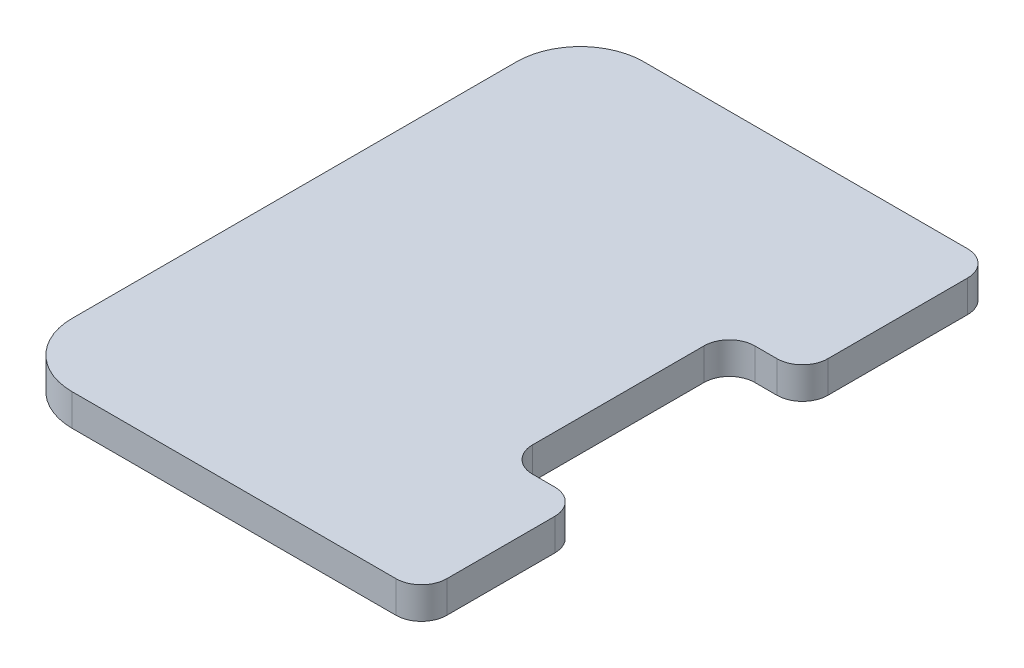
ISO-10303-21;
HEADER;
FILE_DESCRIPTION(('STEP AP214'),'2;1');
FILE_NAME('part.step','',(''),(''),'','','');
FILE_SCHEMA(('AUTOMOTIVE_DESIGN { 1 0 10303 214 1 1 1 1 }'));
ENDSEC;
DATA;
#1=APPLICATION_CONTEXT('core data for automotive mechanical design processes');
#2=APPLICATION_PROTOCOL_DEFINITION('international standard','automotive_design',2000,#1);
#3=PRODUCT_CONTEXT('',#1,'mechanical');
#4=PRODUCT('Part','Part','',(#3));
#5=PRODUCT_RELATED_PRODUCT_CATEGORY('part','',(#4));
#6=PRODUCT_DEFINITION_FORMATION('','',#4);
#7=PRODUCT_DEFINITION_CONTEXT('part definition',#1,'design');
#8=PRODUCT_DEFINITION('design','',#6,#7);
#9=PRODUCT_DEFINITION_SHAPE('','',#8);
#10=(LENGTH_UNIT() NAMED_UNIT(*) SI_UNIT(.MILLI.,.METRE.));
#11=(NAMED_UNIT(*) PLANE_ANGLE_UNIT() SI_UNIT($,.RADIAN.));
#12=(NAMED_UNIT(*) SI_UNIT($,.STERADIAN.) SOLID_ANGLE_UNIT());
#13=UNCERTAINTY_MEASURE_WITH_UNIT(LENGTH_MEASURE(1.E-05),#10,'distance_accuracy_value','');
#14=(GEOMETRIC_REPRESENTATION_CONTEXT(3) GLOBAL_UNCERTAINTY_ASSIGNED_CONTEXT((#13)) GLOBAL_UNIT_ASSIGNED_CONTEXT((#10,
#11,#12)) REPRESENTATION_CONTEXT('',''));
#15=CARTESIAN_POINT('',(0.,0.,0.));
#16=DIRECTION('',(0.,0.,1.));
#17=DIRECTION('',(1.,0.,0.));
#18=AXIS2_PLACEMENT_3D('',#15,#16,#17);
#19=CARTESIAN_POINT('',(20.6375,3.175,-28.575));
#20=DIRECTION('',(-1.,0.,0.));
#21=DIRECTION('',(0.,0.,-1.));
#22=AXIS2_PLACEMENT_3D('',#19,#20,#21);
#23=PLANE('',#22);
#24=DIRECTION('',(0.,0.,1.));
#25=VECTOR('',#24,1.);
#26=CARTESIAN_POINT('',(20.6375,3.175,-28.575));
#27=LINE('',#26,#25);
#28=CARTESIAN_POINT('',(20.6375,3.175,-26.035));
#29=VERTEX_POINT('',#28);
#30=CARTESIAN_POINT('',(20.6375,3.175,-12.065));
#31=VERTEX_POINT('',#30);
#32=EDGE_CURVE('E346',#29,#31,#27,.T.);
#33=ORIENTED_EDGE('',*,*,#32,.T.);
#34=DIRECTION('',(0.,1.,0.));
#35=VECTOR('',#34,1.);
#36=CARTESIAN_POINT('',(20.6375,3.175,-12.065));
#37=LINE('',#36,#35);
#38=CARTESIAN_POINT('',(20.6375,0.,-12.065));
#39=VERTEX_POINT('',#38);
#40=EDGE_CURVE('E216',#39,#31,#37,.T.);
#41=ORIENTED_EDGE('',*,*,#40,.F.);
#42=DIRECTION('',(0.,0.,1.));
#43=VECTOR('',#42,1.);
#44=CARTESIAN_POINT('',(20.6375,0.,-28.575));
#45=LINE('',#44,#43);
#46=CARTESIAN_POINT('',(20.6375,0.,-26.035));
#47=VERTEX_POINT('',#46);
#48=EDGE_CURVE('E196',#47,#39,#45,.T.);
#49=ORIENTED_EDGE('',*,*,#48,.F.);
#50=DIRECTION('',(0.,-1.,0.));
#51=VECTOR('',#50,1.);
#52=CARTESIAN_POINT('',(20.6375,3.175,-26.035));
#53=LINE('',#52,#51);
#54=EDGE_CURVE('E208',#29,#47,#53,.T.);
#55=ORIENTED_EDGE('',*,*,#54,.F.);
#56=EDGE_LOOP('',(#33,#41,#49,#55));
#57=FACE_BOUND('',#56,.T.);
#58=ADVANCED_FACE('F47',(#57),#23,.F.);
#59=CARTESIAN_POINT('',(20.6375,0.,15.24));
#60=VERTEX_POINT('',#59);
#61=CARTESIAN_POINT('',(20.6375,0.,26.035));
#62=VERTEX_POINT('',#61);
#63=EDGE_CURVE('E221',#60,#62,#45,.T.);
#64=ORIENTED_EDGE('',*,*,#63,.F.);
#65=DIRECTION('',(0.,1.,0.));
#66=VECTOR('',#65,1.);
#67=CARTESIAN_POINT('',(20.6375,3.175,15.24));
#68=LINE('',#67,#66);
#69=CARTESIAN_POINT('',(20.6375,3.175,15.24));
#70=VERTEX_POINT('',#69);
#71=EDGE_CURVE('E268',#70,#60,#68,.F.);
#72=ORIENTED_EDGE('',*,*,#71,.F.);
#73=CARTESIAN_POINT('',(20.6375,3.175,26.035));
#74=VERTEX_POINT('',#73);
#75=EDGE_CURVE('E241',#70,#74,#27,.T.);
#76=ORIENTED_EDGE('',*,*,#75,.T.);
#77=DIRECTION('',(0.,-1.,0.));
#78=VECTOR('',#77,1.);
#79=CARTESIAN_POINT('',(20.6375,3.175,26.035));
#80=LINE('',#79,#78);
#81=EDGE_CURVE('E272',#62,#74,#80,.F.);
#82=ORIENTED_EDGE('',*,*,#81,.F.);
#83=EDGE_LOOP('',(#64,#72,#76,#82));
#84=FACE_BOUND('',#83,.T.);
#85=ADVANCED_FACE('F393',(#84),#23,.F.);
#86=CARTESIAN_POINT('',(-20.6375,3.175,28.575));
#87=DIRECTION('',(0.,0.,-1.));
#88=DIRECTION('',(1.,0.,0.));
#89=AXIS2_PLACEMENT_3D('',#86,#87,#88);
#90=PLANE('',#89);
#91=DIRECTION('',(-1.,0.,0.));
#92=VECTOR('',#91,1.);
#93=CARTESIAN_POINT('',(-20.6375,0.,28.575));
#94=LINE('',#93,#92);
#95=CARTESIAN_POINT('',(18.0975,0.,28.575));
#96=VERTEX_POINT('',#95);
#97=CARTESIAN_POINT('',(-14.2875,0.,28.575));
#98=VERTEX_POINT('',#97);
#99=EDGE_CURVE('E220',#96,#98,#94,.T.);
#100=ORIENTED_EDGE('',*,*,#99,.F.);
#101=DIRECTION('',(0.,-1.,0.));
#102=VECTOR('',#101,1.);
#103=CARTESIAN_POINT('',(18.0975,3.175,28.575));
#104=LINE('',#103,#102);
#105=CARTESIAN_POINT('',(18.0975,3.175,28.575));
#106=VERTEX_POINT('',#105);
#107=EDGE_CURVE('E264',#106,#96,#104,.T.);
#108=ORIENTED_EDGE('',*,*,#107,.F.);
#109=DIRECTION('',(-1.,0.,0.));
#110=VECTOR('',#109,1.);
#111=CARTESIAN_POINT('',(-20.6375,3.175,28.575));
#112=LINE('',#111,#110);
#113=CARTESIAN_POINT('',(-14.2875,3.175,28.575));
#114=VERTEX_POINT('',#113);
#115=EDGE_CURVE('E341',#106,#114,#112,.T.);
#116=ORIENTED_EDGE('',*,*,#115,.T.);
#117=DIRECTION('',(0.,-1.,0.));
#118=VECTOR('',#117,1.);
#119=CARTESIAN_POINT('',(-14.2875,3.175,28.575));
#120=LINE('',#119,#118);
#121=EDGE_CURVE('E11',#98,#114,#120,.F.);
#122=ORIENTED_EDGE('',*,*,#121,.F.);
#123=EDGE_LOOP('',(#100,#108,#116,#122));
#124=FACE_BOUND('',#123,.T.);
#125=ADVANCED_FACE('F400',(#124),#90,.F.);
#126=CARTESIAN_POINT('',(-20.6375,3.175,-28.575));
#127=DIRECTION('',(1.,0.,0.));
#128=DIRECTION('',(0.,0.,1.));
#129=AXIS2_PLACEMENT_3D('',#126,#127,#128);
#130=PLANE('',#129);
#131=DIRECTION('',(0.,0.,-1.));
#132=VECTOR('',#131,1.);
#133=CARTESIAN_POINT('',(-20.6375,0.,-28.575));
#134=LINE('',#133,#132);
#135=CARTESIAN_POINT('',(-20.6375,0.,22.225));
#136=VERTEX_POINT('',#135);
#137=CARTESIAN_POINT('',(-20.6375,0.,-22.225));
#138=VERTEX_POINT('',#137);
#139=EDGE_CURVE('E227',#136,#138,#134,.T.);
#140=ORIENTED_EDGE('',*,*,#139,.F.);
#141=DIRECTION('',(0.,-1.,0.));
#142=VECTOR('',#141,1.);
#143=CARTESIAN_POINT('',(-20.6375,3.175,22.225));
#144=LINE('',#143,#142);
#145=CARTESIAN_POINT('',(-20.6375,3.175,22.225));
#146=VERTEX_POINT('',#145);
#147=EDGE_CURVE('E320',#146,#136,#144,.T.);
#148=ORIENTED_EDGE('',*,*,#147,.F.);
#149=DIRECTION('',(0.,0.,-1.));
#150=VECTOR('',#149,1.);
#151=CARTESIAN_POINT('',(-20.6375,3.175,-28.575));
#152=LINE('',#151,#150);
#153=CARTESIAN_POINT('',(-20.6375,3.175,-22.225));
#154=VERTEX_POINT('',#153);
#155=EDGE_CURVE('E339',#146,#154,#152,.T.);
#156=ORIENTED_EDGE('',*,*,#155,.T.);
#157=DIRECTION('',(0.,-1.,0.));
#158=VECTOR('',#157,1.);
#159=CARTESIAN_POINT('',(-20.6375,3.175,-22.225));
#160=LINE('',#159,#158);
#161=EDGE_CURVE('E324',#138,#154,#160,.F.);
#162=ORIENTED_EDGE('',*,*,#161,.F.);
#163=EDGE_LOOP('',(#140,#148,#156,#162));
#164=FACE_BOUND('',#163,.T.);
#165=ADVANCED_FACE('F403',(#164),#130,.F.);
#166=CARTESIAN_POINT('',(-20.6375,3.175,-28.575));
#167=DIRECTION('',(0.,0.,1.));
#168=DIRECTION('',(-1.,0.,0.));
#169=AXIS2_PLACEMENT_3D('',#166,#167,#168);
#170=PLANE('',#169);
#171=DIRECTION('',(1.,0.,0.));
#172=VECTOR('',#171,1.);
#173=CARTESIAN_POINT('',(-20.6375,3.175,-28.575));
#174=LINE('',#173,#172);
#175=CARTESIAN_POINT('',(-14.2875,3.175,-28.575));
#176=VERTEX_POINT('',#175);
#177=CARTESIAN_POINT('',(18.0975,3.175,-28.575));
#178=VERTEX_POINT('',#177);
#179=EDGE_CURVE('E233',#176,#178,#174,.T.);
#180=ORIENTED_EDGE('',*,*,#179,.T.);
#181=DIRECTION('',(0.,-1.,0.));
#182=VECTOR('',#181,1.);
#183=CARTESIAN_POINT('',(18.0975,3.175,-28.575));
#184=LINE('',#183,#182);
#185=CARTESIAN_POINT('',(18.0975,0.,-28.575));
#186=VERTEX_POINT('',#185);
#187=EDGE_CURVE('E204',#186,#178,#184,.F.);
#188=ORIENTED_EDGE('',*,*,#187,.F.);
#189=DIRECTION('',(1.,0.,0.));
#190=VECTOR('',#189,1.);
#191=CARTESIAN_POINT('',(-20.6375,0.,-28.575));
#192=LINE('',#191,#190);
#193=CARTESIAN_POINT('',(-14.2875,0.,-28.575));
#194=VERTEX_POINT('',#193);
#195=EDGE_CURVE('E199',#194,#186,#192,.T.);
#196=ORIENTED_EDGE('',*,*,#195,.F.);
#197=DIRECTION('',(0.,-1.,0.));
#198=VECTOR('',#197,1.);
#199=CARTESIAN_POINT('',(-14.2875,3.175,-28.575));
#200=LINE('',#199,#198);
#201=EDGE_CURVE('E310',#176,#194,#200,.T.);
#202=ORIENTED_EDGE('',*,*,#201,.F.);
#203=EDGE_LOOP('',(#180,#188,#196,#202));
#204=FACE_BOUND('',#203,.T.);
#205=ADVANCED_FACE('F336',(#204),#170,.F.);
#206=CARTESIAN_POINT('',(0.,3.175,0.));
#207=DIRECTION('',(0.,-1.,0.));
#208=DIRECTION('',(0.,0.,1.));
#209=AXIS2_PLACEMENT_3D('',#206,#207,#208);
#210=PLANE('',#209);
#211=ORIENTED_EDGE('',*,*,#155,.F.);
#212=CARTESIAN_POINT('',(-14.2875,3.175,22.225));
#213=DIRECTION('',(0.,1.,0.));
#214=DIRECTION('',(0.,0.,1.));
#215=AXIS2_PLACEMENT_3D('',#212,#213,#214);
#216=CIRCLE('',#215,6.35);
#217=EDGE_CURVE('E66',#114,#146,#216,.F.);
#218=ORIENTED_EDGE('',*,*,#217,.F.);
#219=ORIENTED_EDGE('',*,*,#115,.F.);
#220=CARTESIAN_POINT('',(18.0975,3.175,26.035));
#221=DIRECTION('',(0.,1.,0.));
#222=DIRECTION('',(0.,0.,1.));
#223=AXIS2_PLACEMENT_3D('',#220,#221,#222);
#224=CIRCLE('',#223,2.54);
#225=EDGE_CURVE('E259',#74,#106,#224,.F.);
#226=ORIENTED_EDGE('',*,*,#225,.F.);
#227=ORIENTED_EDGE('',*,*,#75,.F.);
#228=CARTESIAN_POINT('',(18.0975,3.175,15.24));
#229=DIRECTION('',(0.,1.,0.));
#230=DIRECTION('',(0.,0.,1.));
#231=AXIS2_PLACEMENT_3D('',#228,#229,#230);
#232=CIRCLE('',#231,2.54);
#233=CARTESIAN_POINT('',(18.0975,3.175,12.7));
#234=VERTEX_POINT('',#233);
#235=EDGE_CURVE('E252',#234,#70,#232,.F.);
#236=ORIENTED_EDGE('',*,*,#235,.F.);
#237=DIRECTION('',(-1.,0.,0.));
#238=VECTOR('',#237,1.);
#239=CARTESIAN_POINT('',(13.335,3.175,12.7));
#240=LINE('',#239,#238);
#241=CARTESIAN_POINT('',(15.875,3.175,12.7));
#242=VERTEX_POINT('',#241);
#243=EDGE_CURVE('E361',#234,#242,#240,.T.);
#244=ORIENTED_EDGE('',*,*,#243,.T.);
#245=CARTESIAN_POINT('',(15.875,3.175,10.16));
#246=DIRECTION('',(0.,1.,0.));
#247=DIRECTION('',(0.,0.,1.));
#248=AXIS2_PLACEMENT_3D('',#245,#246,#247);
#249=CIRCLE('',#248,2.54);
#250=CARTESIAN_POINT('',(13.335,3.175,10.16));
#251=VERTEX_POINT('',#250);
#252=EDGE_CURVE('E302',#251,#242,#249,.T.);
#253=ORIENTED_EDGE('',*,*,#252,.F.);
#254=DIRECTION('',(0.,0.,-1.));
#255=VECTOR('',#254,1.);
#256=CARTESIAN_POINT('',(13.335,3.175,-9.525));
#257=LINE('',#256,#255);
#258=CARTESIAN_POINT('',(13.335,3.175,-6.985));
#259=VERTEX_POINT('',#258);
#260=EDGE_CURVE('E357',#251,#259,#257,.T.);
#261=ORIENTED_EDGE('',*,*,#260,.T.);
#262=CARTESIAN_POINT('',(15.875,3.175,-6.985));
#263=DIRECTION('',(0.,1.,0.));
#264=DIRECTION('',(0.,0.,1.));
#265=AXIS2_PLACEMENT_3D('',#262,#263,#264);
#266=CIRCLE('',#265,2.54);
#267=CARTESIAN_POINT('',(15.875,3.175,-9.525));
#268=VERTEX_POINT('',#267);
#269=EDGE_CURVE('E294',#268,#259,#266,.T.);
#270=ORIENTED_EDGE('',*,*,#269,.F.);
#271=DIRECTION('',(1.,0.,0.));
#272=VECTOR('',#271,1.);
#273=CARTESIAN_POINT('',(20.6375,3.175,-9.525));
#274=LINE('',#273,#272);
#275=CARTESIAN_POINT('',(18.0975,3.175,-9.525));
#276=VERTEX_POINT('',#275);
#277=EDGE_CURVE('E352',#268,#276,#274,.T.);
#278=ORIENTED_EDGE('',*,*,#277,.T.);
#279=CARTESIAN_POINT('',(18.0975,3.175,-12.065));
#280=DIRECTION('',(0.,1.,0.));
#281=DIRECTION('',(0.,0.,1.));
#282=AXIS2_PLACEMENT_3D('',#279,#280,#281);
#283=CIRCLE('',#282,2.54);
#284=EDGE_CURVE('E255',#31,#276,#283,.F.);
#285=ORIENTED_EDGE('',*,*,#284,.F.);
#286=ORIENTED_EDGE('',*,*,#32,.F.);
#287=CARTESIAN_POINT('',(18.0975,3.175,-26.035));
#288=DIRECTION('',(0.,1.,0.));
#289=DIRECTION('',(0.,0.,1.));
#290=AXIS2_PLACEMENT_3D('',#287,#288,#289);
#291=CIRCLE('',#290,2.54);
#292=EDGE_CURVE('E210',#178,#29,#291,.F.);
#293=ORIENTED_EDGE('',*,*,#292,.F.);
#294=ORIENTED_EDGE('',*,*,#179,.F.);
#295=CARTESIAN_POINT('',(-14.2875,3.175,-22.225));
#296=DIRECTION('',(0.,1.,0.));
#297=DIRECTION('',(0.,0.,1.));
#298=AXIS2_PLACEMENT_3D('',#295,#296,#297);
#299=CIRCLE('',#298,6.35);
#300=EDGE_CURVE('E56',#154,#176,#299,.F.);
#301=ORIENTED_EDGE('',*,*,#300,.F.);
#302=EDGE_LOOP('',(#211,#218,#219,#226,#227,#236,#244,#253,#261,#270,#278,#285,#286,#293,#294,#301));
#303=FACE_BOUND('',#302,.T.);
#304=ADVANCED_FACE('F337',(#303),#210,.F.);
#305=CARTESIAN_POINT('',(0.,0.,0.));
#306=DIRECTION('',(0.,-1.,0.));
#307=DIRECTION('',(0.,0.,1.));
#308=AXIS2_PLACEMENT_3D('',#305,#306,#307);
#309=PLANE('',#308);
#310=ORIENTED_EDGE('',*,*,#195,.T.);
#311=CARTESIAN_POINT('',(18.0975,0.,-26.035));
#312=DIRECTION('',(0.,1.,0.));
#313=DIRECTION('',(0.,0.,1.));
#314=AXIS2_PLACEMENT_3D('',#311,#312,#313);
#315=CIRCLE('',#314,2.54);
#316=EDGE_CURVE('E191',#47,#186,#315,.T.);
#317=ORIENTED_EDGE('',*,*,#316,.F.);
#318=ORIENTED_EDGE('',*,*,#48,.T.);
#319=CARTESIAN_POINT('',(18.0975,0.,-12.065));
#320=DIRECTION('',(0.,1.,0.));
#321=DIRECTION('',(0.,0.,1.));
#322=AXIS2_PLACEMENT_3D('',#319,#320,#321);
#323=CIRCLE('',#322,2.54);
#324=CARTESIAN_POINT('',(18.0975,0.,-9.525));
#325=VERTEX_POINT('',#324);
#326=EDGE_CURVE('E246',#325,#39,#323,.T.);
#327=ORIENTED_EDGE('',*,*,#326,.F.);
#328=DIRECTION('',(1.,0.,0.));
#329=VECTOR('',#328,1.);
#330=CARTESIAN_POINT('',(20.6375,0.,-9.525));
#331=LINE('',#330,#329);
#332=CARTESIAN_POINT('',(15.875,0.,-9.525));
#333=VERTEX_POINT('',#332);
#334=EDGE_CURVE('E231',#333,#325,#331,.T.);
#335=ORIENTED_EDGE('',*,*,#334,.F.);
#336=CARTESIAN_POINT('',(15.875,0.,-6.985));
#337=DIRECTION('',(0.,1.,0.));
#338=DIRECTION('',(0.,0.,1.));
#339=AXIS2_PLACEMENT_3D('',#336,#337,#338);
#340=CIRCLE('',#339,2.54);
#341=CARTESIAN_POINT('',(13.335,0.,-6.985));
#342=VERTEX_POINT('',#341);
#343=EDGE_CURVE('E298',#342,#333,#340,.F.);
#344=ORIENTED_EDGE('',*,*,#343,.F.);
#345=DIRECTION('',(0.,0.,-1.));
#346=VECTOR('',#345,1.);
#347=CARTESIAN_POINT('',(13.335,0.,-9.525));
#348=LINE('',#347,#346);
#349=CARTESIAN_POINT('',(13.335,0.,10.16));
#350=VERTEX_POINT('',#349);
#351=EDGE_CURVE('E368',#350,#342,#348,.T.);
#352=ORIENTED_EDGE('',*,*,#351,.F.);
#353=CARTESIAN_POINT('',(15.875,0.,10.16));
#354=DIRECTION('',(0.,1.,0.));
#355=DIRECTION('',(0.,0.,1.));
#356=AXIS2_PLACEMENT_3D('',#353,#354,#355);
#357=CIRCLE('',#356,2.54);
#358=CARTESIAN_POINT('',(15.875,0.,12.7));
#359=VERTEX_POINT('',#358);
#360=EDGE_CURVE('E306',#359,#350,#357,.F.);
#361=ORIENTED_EDGE('',*,*,#360,.F.);
#362=DIRECTION('',(-1.,0.,0.));
#363=VECTOR('',#362,1.);
#364=CARTESIAN_POINT('',(13.335,0.,12.7));
#365=LINE('',#364,#363);
#366=CARTESIAN_POINT('',(18.0975,0.,12.7));
#367=VERTEX_POINT('',#366);
#368=EDGE_CURVE('E356',#367,#359,#365,.T.);
#369=ORIENTED_EDGE('',*,*,#368,.F.);
#370=CARTESIAN_POINT('',(18.0975,0.,15.24));
#371=DIRECTION('',(0.,1.,0.));
#372=DIRECTION('',(0.,0.,1.));
#373=AXIS2_PLACEMENT_3D('',#370,#371,#372);
#374=CIRCLE('',#373,2.54);
#375=EDGE_CURVE('E215',#60,#367,#374,.T.);
#376=ORIENTED_EDGE('',*,*,#375,.F.);
#377=ORIENTED_EDGE('',*,*,#63,.T.);
#378=CARTESIAN_POINT('',(18.0975,0.,26.035));
#379=DIRECTION('',(0.,1.,0.));
#380=DIRECTION('',(0.,0.,1.));
#381=AXIS2_PLACEMENT_3D('',#378,#379,#380);
#382=CIRCLE('',#381,2.54);
#383=EDGE_CURVE('E205',#96,#62,#382,.T.);
#384=ORIENTED_EDGE('',*,*,#383,.F.);
#385=ORIENTED_EDGE('',*,*,#99,.T.);
#386=CARTESIAN_POINT('',(-14.2875,0.,22.225));
#387=DIRECTION('',(0.,1.,0.));
#388=DIRECTION('',(0.,0.,1.));
#389=AXIS2_PLACEMENT_3D('',#386,#387,#388);
#390=CIRCLE('',#389,6.35);
#391=EDGE_CURVE('E314',#136,#98,#390,.T.);
#392=ORIENTED_EDGE('',*,*,#391,.F.);
#393=ORIENTED_EDGE('',*,*,#139,.T.);
#394=CARTESIAN_POINT('',(-14.2875,0.,-22.225));
#395=DIRECTION('',(0.,1.,0.));
#396=DIRECTION('',(0.,0.,1.));
#397=AXIS2_PLACEMENT_3D('',#394,#395,#396);
#398=CIRCLE('',#397,6.35);
#399=EDGE_CURVE('E317',#194,#138,#398,.T.);
#400=ORIENTED_EDGE('',*,*,#399,.F.);
#401=EDGE_LOOP('',(#310,#317,#318,#327,#335,#344,#352,#361,#369,#376,#377,#384,#385,#392,#393,#400));
#402=FACE_BOUND('',#401,.T.);
#403=ADVANCED_FACE('F193',(#402),#309,.T.);
#404=CARTESIAN_POINT('',(20.6375,0.,-9.525));
#405=DIRECTION('',(0.,0.,-1.));
#406=DIRECTION('',(1.,0.,0.));
#407=AXIS2_PLACEMENT_3D('',#404,#405,#406);
#408=PLANE('',#407);
#409=ORIENTED_EDGE('',*,*,#277,.F.);
#410=DIRECTION('',(0.,1.,0.));
#411=VECTOR('',#410,1.);
#412=CARTESIAN_POINT('',(15.875,3.175,-9.525));
#413=LINE('',#412,#411);
#414=EDGE_CURVE('E276',#333,#268,#413,.T.);
#415=ORIENTED_EDGE('',*,*,#414,.F.);
#416=ORIENTED_EDGE('',*,*,#334,.T.);
#417=DIRECTION('',(0.,1.,0.));
#418=VECTOR('',#417,1.);
#419=CARTESIAN_POINT('',(18.0975,0.,-9.525));
#420=LINE('',#419,#418);
#421=EDGE_CURVE('E279',#276,#325,#420,.F.);
#422=ORIENTED_EDGE('',*,*,#421,.F.);
#423=EDGE_LOOP('',(#409,#415,#416,#422));
#424=FACE_BOUND('',#423,.T.);
#425=ADVANCED_FACE('F504',(#424),#408,.F.);
#426=CARTESIAN_POINT('',(13.335,0.,-9.525));
#427=DIRECTION('',(-1.,0.,0.));
#428=DIRECTION('',(0.,0.,-1.));
#429=AXIS2_PLACEMENT_3D('',#426,#427,#428);
#430=PLANE('',#429);
#431=ORIENTED_EDGE('',*,*,#260,.F.);
#432=DIRECTION('',(0.,1.,0.));
#433=VECTOR('',#432,1.);
#434=CARTESIAN_POINT('',(13.335,3.175,10.16));
#435=LINE('',#434,#433);
#436=EDGE_CURVE('E282',#350,#251,#435,.T.);
#437=ORIENTED_EDGE('',*,*,#436,.F.);
#438=ORIENTED_EDGE('',*,*,#351,.T.);
#439=DIRECTION('',(0.,1.,0.));
#440=VECTOR('',#439,1.);
#441=CARTESIAN_POINT('',(13.335,0.,-6.985));
#442=LINE('',#441,#440);
#443=EDGE_CURVE('E285',#259,#342,#442,.F.);
#444=ORIENTED_EDGE('',*,*,#443,.F.);
#445=EDGE_LOOP('',(#431,#437,#438,#444));
#446=FACE_BOUND('',#445,.T.);
#447=ADVANCED_FACE('F495',(#446),#430,.F.);
#448=CARTESIAN_POINT('',(13.335,0.,12.7));
#449=DIRECTION('',(0.,0.,1.));
#450=DIRECTION('',(-1.,0.,0.));
#451=AXIS2_PLACEMENT_3D('',#448,#449,#450);
#452=PLANE('',#451);
#453=ORIENTED_EDGE('',*,*,#368,.T.);
#454=DIRECTION('',(0.,1.,0.));
#455=VECTOR('',#454,1.);
#456=CARTESIAN_POINT('',(15.875,0.,12.7));
#457=LINE('',#456,#455);
#458=EDGE_CURVE('E288',#242,#359,#457,.F.);
#459=ORIENTED_EDGE('',*,*,#458,.F.);
#460=ORIENTED_EDGE('',*,*,#243,.F.);
#461=DIRECTION('',(0.,1.,0.));
#462=VECTOR('',#461,1.);
#463=CARTESIAN_POINT('',(18.0975,0.,12.7));
#464=LINE('',#463,#462);
#465=EDGE_CURVE('E291',#367,#234,#464,.T.);
#466=ORIENTED_EDGE('',*,*,#465,.F.);
#467=EDGE_LOOP('',(#453,#459,#460,#466));
#468=FACE_BOUND('',#467,.T.);
#469=ADVANCED_FACE('F377',(#468),#452,.F.);
#470=CARTESIAN_POINT('',(18.0975,3.175,-26.035));
#471=DIRECTION('',(0.,-1.,0.));
#472=DIRECTION('',(0.,0.,1.));
#473=AXIS2_PLACEMENT_3D('',#470,#471,#472);
#474=CYLINDRICAL_SURFACE('',#473,2.54);
#475=ORIENTED_EDGE('',*,*,#292,.T.);
#476=ORIENTED_EDGE('',*,*,#54,.T.);
#477=ORIENTED_EDGE('',*,*,#316,.T.);
#478=ORIENTED_EDGE('',*,*,#187,.T.);
#479=EDGE_LOOP('',(#475,#476,#477,#478));
#480=FACE_BOUND('',#479,.T.);
#481=ADVANCED_FACE('F209',(#480),#474,.T.);
#482=CARTESIAN_POINT('',(18.0975,3.175,26.035));
#483=DIRECTION('',(0.,-1.,0.));
#484=DIRECTION('',(0.,0.,1.));
#485=AXIS2_PLACEMENT_3D('',#482,#483,#484);
#486=CYLINDRICAL_SURFACE('',#485,2.54);
#487=ORIENTED_EDGE('',*,*,#225,.T.);
#488=ORIENTED_EDGE('',*,*,#107,.T.);
#489=ORIENTED_EDGE('',*,*,#383,.T.);
#490=ORIENTED_EDGE('',*,*,#81,.T.);
#491=EDGE_LOOP('',(#487,#488,#489,#490));
#492=FACE_BOUND('',#491,.T.);
#493=ADVANCED_FACE('F395',(#492),#486,.T.);
#494=CARTESIAN_POINT('',(18.0975,3.175,-12.065));
#495=DIRECTION('',(0.,1.,0.));
#496=DIRECTION('',(0.,0.,-1.));
#497=AXIS2_PLACEMENT_3D('',#494,#495,#496);
#498=CYLINDRICAL_SURFACE('',#497,2.54);
#499=ORIENTED_EDGE('',*,*,#326,.T.);
#500=ORIENTED_EDGE('',*,*,#40,.T.);
#501=ORIENTED_EDGE('',*,*,#284,.T.);
#502=ORIENTED_EDGE('',*,*,#421,.T.);
#503=EDGE_LOOP('',(#499,#500,#501,#502));
#504=FACE_BOUND('',#503,.T.);
#505=ADVANCED_FACE('F423',(#504),#498,.T.);
#506=CARTESIAN_POINT('',(15.875,0.,-6.985));
#507=DIRECTION('',(0.,-1.,0.));
#508=DIRECTION('',(0.,0.,1.));
#509=AXIS2_PLACEMENT_3D('',#506,#507,#508);
#510=CYLINDRICAL_SURFACE('',#509,2.54);
#511=ORIENTED_EDGE('',*,*,#343,.T.);
#512=ORIENTED_EDGE('',*,*,#414,.T.);
#513=ORIENTED_EDGE('',*,*,#269,.T.);
#514=ORIENTED_EDGE('',*,*,#443,.T.);
#515=EDGE_LOOP('',(#511,#512,#513,#514));
#516=FACE_BOUND('',#515,.T.);
#517=ADVANCED_FACE('F426',(#516),#510,.F.);
#518=CARTESIAN_POINT('',(18.0975,0.,15.24));
#519=DIRECTION('',(0.,1.,0.));
#520=DIRECTION('',(0.,0.,-1.));
#521=AXIS2_PLACEMENT_3D('',#518,#519,#520);
#522=CYLINDRICAL_SURFACE('',#521,2.54);
#523=ORIENTED_EDGE('',*,*,#375,.T.);
#524=ORIENTED_EDGE('',*,*,#465,.T.);
#525=ORIENTED_EDGE('',*,*,#235,.T.);
#526=ORIENTED_EDGE('',*,*,#71,.T.);
#527=EDGE_LOOP('',(#523,#524,#525,#526));
#528=FACE_BOUND('',#527,.T.);
#529=ADVANCED_FACE('F389',(#528),#522,.T.);
#530=CARTESIAN_POINT('',(15.875,0.,10.16));
#531=DIRECTION('',(0.,-1.,0.));
#532=DIRECTION('',(0.,0.,1.));
#533=AXIS2_PLACEMENT_3D('',#530,#531,#532);
#534=CYLINDRICAL_SURFACE('',#533,2.54);
#535=ORIENTED_EDGE('',*,*,#360,.T.);
#536=ORIENTED_EDGE('',*,*,#436,.T.);
#537=ORIENTED_EDGE('',*,*,#252,.T.);
#538=ORIENTED_EDGE('',*,*,#458,.T.);
#539=EDGE_LOOP('',(#535,#536,#537,#538));
#540=FACE_BOUND('',#539,.T.);
#541=ADVANCED_FACE('F382',(#540),#534,.F.);
#542=CARTESIAN_POINT('',(-14.2875,3.175,-22.225));
#543=DIRECTION('',(0.,-1.,0.));
#544=DIRECTION('',(0.,0.,1.));
#545=AXIS2_PLACEMENT_3D('',#542,#543,#544);
#546=CYLINDRICAL_SURFACE('',#545,6.35);
#547=ORIENTED_EDGE('',*,*,#300,.T.);
#548=ORIENTED_EDGE('',*,*,#201,.T.);
#549=ORIENTED_EDGE('',*,*,#399,.T.);
#550=ORIENTED_EDGE('',*,*,#161,.T.);
#551=EDGE_LOOP('',(#547,#548,#549,#550));
#552=FACE_BOUND('',#551,.T.);
#553=ADVANCED_FACE('F331',(#552),#546,.T.);
#554=CARTESIAN_POINT('',(-14.2875,3.175,22.225));
#555=DIRECTION('',(0.,-1.,0.));
#556=DIRECTION('',(0.,0.,1.));
#557=AXIS2_PLACEMENT_3D('',#554,#555,#556);
#558=CYLINDRICAL_SURFACE('',#557,6.35);
#559=ORIENTED_EDGE('',*,*,#217,.T.);
#560=ORIENTED_EDGE('',*,*,#147,.T.);
#561=ORIENTED_EDGE('',*,*,#391,.T.);
#562=ORIENTED_EDGE('',*,*,#121,.T.);
#563=EDGE_LOOP('',(#559,#560,#561,#562));
#564=FACE_BOUND('',#563,.T.);
#565=ADVANCED_FACE('F49',(#564),#558,.T.);
#566=CLOSED_SHELL('',(#58,#85,#125,#165,#205,#304,#403,#425,#447,#469,#481,#493,#505,#517,#529,
#541,#553,#565));
#567=MANIFOLD_SOLID_BREP('B2',#566);
#568=ADVANCED_BREP_SHAPE_REPRESENTATION('',(#18,#567),#14);
#569=SHAPE_DEFINITION_REPRESENTATION(#9,#568);
ENDSEC;
END-ISO-10303-21;
